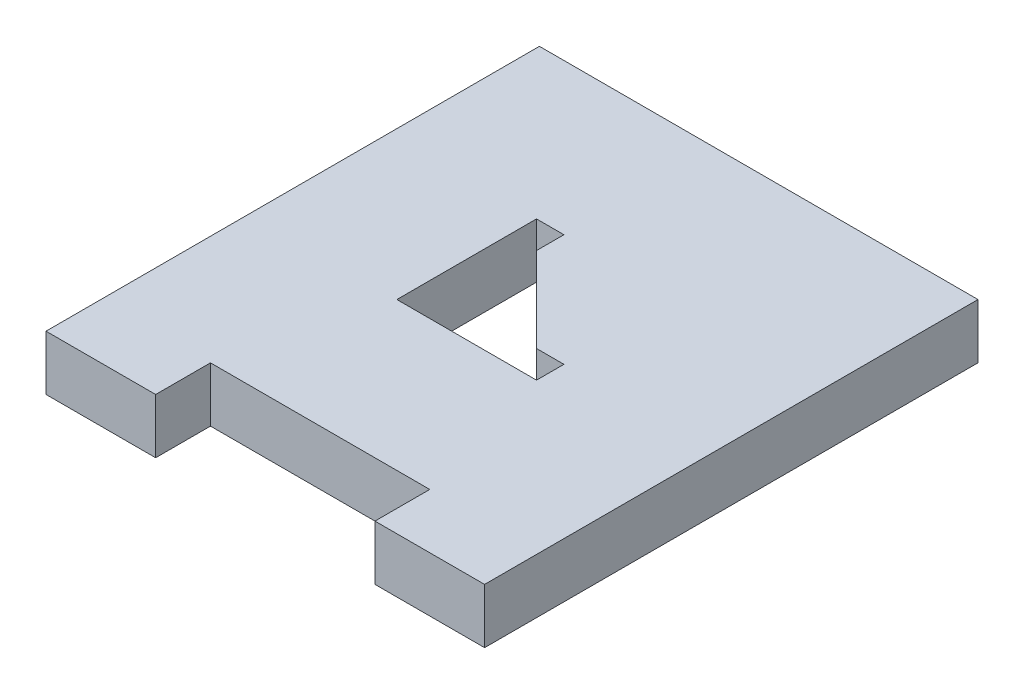
ISO-10303-21;
HEADER;
FILE_DESCRIPTION(('STEP AP214'),'2;1');
FILE_NAME('part.step','',(''),(''),'','','');
FILE_SCHEMA(('AUTOMOTIVE_DESIGN { 1 0 10303 214 1 1 1 1 }'));
ENDSEC;
DATA;
#1=APPLICATION_CONTEXT('core data for automotive mechanical design processes');
#2=APPLICATION_PROTOCOL_DEFINITION('international standard','automotive_design',2000,#1);
#3=PRODUCT_CONTEXT('',#1,'mechanical');
#4=PRODUCT('Part','Part','',(#3));
#5=PRODUCT_RELATED_PRODUCT_CATEGORY('part','',(#4));
#6=PRODUCT_DEFINITION_FORMATION('','',#4);
#7=PRODUCT_DEFINITION_CONTEXT('part definition',#1,'design');
#8=PRODUCT_DEFINITION('design','',#6,#7);
#9=PRODUCT_DEFINITION_SHAPE('','',#8);
#10=(LENGTH_UNIT() NAMED_UNIT(*) SI_UNIT(.MILLI.,.METRE.));
#11=(NAMED_UNIT(*) PLANE_ANGLE_UNIT() SI_UNIT($,.RADIAN.));
#12=(NAMED_UNIT(*) SI_UNIT($,.STERADIAN.) SOLID_ANGLE_UNIT());
#13=UNCERTAINTY_MEASURE_WITH_UNIT(LENGTH_MEASURE(1.E-05),#10,'distance_accuracy_value','');
#14=(GEOMETRIC_REPRESENTATION_CONTEXT(3) GLOBAL_UNCERTAINTY_ASSIGNED_CONTEXT((#13)) GLOBAL_UNIT_ASSIGNED_CONTEXT((#10,
#11,#12)) REPRESENTATION_CONTEXT('',''));
#15=CARTESIAN_POINT('',(0.,0.,0.));
#16=DIRECTION('',(0.,0.,1.));
#17=DIRECTION('',(1.,0.,0.));
#18=AXIS2_PLACEMENT_3D('',#15,#16,#17);
#19=CARTESIAN_POINT('',(-12.7,3.175,12.7));
#20=DIRECTION('',(0.,0.,-1.));
#21=DIRECTION('',(-1.,0.,0.));
#22=AXIS2_PLACEMENT_3D('',#19,#20,#21);
#23=PLANE('',#22);
#24=DIRECTION('',(0.,-1.,0.));
#25=VECTOR('',#24,1.);
#26=CARTESIAN_POINT('',(6.35,3.175,12.7));
#27=LINE('',#26,#25);
#28=CARTESIAN_POINT('',(6.35,3.175,12.7));
#29=VERTEX_POINT('',#28);
#30=CARTESIAN_POINT('',(6.35,0.,12.7));
#31=VERTEX_POINT('',#30);
#32=EDGE_CURVE('E251',#29,#31,#27,.T.);
#33=ORIENTED_EDGE('',*,*,#32,.F.);
#34=DIRECTION('',(1.,0.,0.));
#35=VECTOR('',#34,1.);
#36=CARTESIAN_POINT('',(-12.7,3.175,12.7));
#37=LINE('',#36,#35);
#38=CARTESIAN_POINT('',(-6.35,3.175,12.7));
#39=VERTEX_POINT('',#38);
#40=EDGE_CURVE('E209',#39,#29,#37,.T.);
#41=ORIENTED_EDGE('',*,*,#40,.F.);
#42=DIRECTION('',(0.,1.,0.));
#43=VECTOR('',#42,1.);
#44=CARTESIAN_POINT('',(-6.35,3.175,12.7));
#45=LINE('',#44,#43);
#46=CARTESIAN_POINT('',(-6.35,0.,12.7));
#47=VERTEX_POINT('',#46);
#48=EDGE_CURVE('E55',#47,#39,#45,.T.);
#49=ORIENTED_EDGE('',*,*,#48,.F.);
#50=DIRECTION('',(1.,0.,0.));
#51=VECTOR('',#50,1.);
#52=CARTESIAN_POINT('',(-12.7,0.,12.7));
#53=LINE('',#52,#51);
#54=EDGE_CURVE('E205',#47,#31,#53,.T.);
#55=ORIENTED_EDGE('',*,*,#54,.T.);
#56=EDGE_LOOP('',(#33,#41,#49,#55));
#57=FACE_BOUND('',#56,.T.);
#58=ADVANCED_FACE('F33',(#57),#23,.F.);
#59=CARTESIAN_POINT('',(0.,3.175,0.));
#60=DIRECTION('',(0.,-1.,0.));
#61=DIRECTION('',(0.,0.,-1.));
#62=AXIS2_PLACEMENT_3D('',#59,#60,#61);
#63=PLANE('',#62);
#64=DIRECTION('',(0.,0.,-1.));
#65=VECTOR('',#64,1.);
#66=CARTESIAN_POINT('',(12.7,3.175,12.7));
#67=LINE('',#66,#65);
#68=CARTESIAN_POINT('',(12.7,3.175,15.875));
#69=VERTEX_POINT('',#68);
#70=CARTESIAN_POINT('',(12.7,3.175,-12.7));
#71=VERTEX_POINT('',#70);
#72=EDGE_CURVE('E201',#69,#71,#67,.T.);
#73=ORIENTED_EDGE('',*,*,#72,.T.);
#74=DIRECTION('',(-1.,0.,0.));
#75=VECTOR('',#74,1.);
#76=CARTESIAN_POINT('',(-12.7,3.175,-12.7));
#77=LINE('',#76,#75);
#78=CARTESIAN_POINT('',(-12.7,3.175,-12.7));
#79=VERTEX_POINT('',#78);
#80=EDGE_CURVE('E204',#71,#79,#77,.T.);
#81=ORIENTED_EDGE('',*,*,#80,.T.);
#82=DIRECTION('',(0.,0.,1.));
#83=VECTOR('',#82,1.);
#84=CARTESIAN_POINT('',(-12.7,3.175,12.7));
#85=LINE('',#84,#83);
#86=CARTESIAN_POINT('',(-12.7,3.175,15.875));
#87=VERTEX_POINT('',#86);
#88=EDGE_CURVE('E207',#79,#87,#85,.T.);
#89=ORIENTED_EDGE('',*,*,#88,.T.);
#90=DIRECTION('',(-1.,0.,0.));
#91=VECTOR('',#90,1.);
#92=CARTESIAN_POINT('',(-12.7,3.175,15.875));
#93=LINE('',#92,#91);
#94=CARTESIAN_POINT('',(-6.35,3.175,15.875));
#95=VERTEX_POINT('',#94);
#96=EDGE_CURVE('E228',#95,#87,#93,.T.);
#97=ORIENTED_EDGE('',*,*,#96,.F.);
#98=DIRECTION('',(0.,0.,-1.));
#99=VECTOR('',#98,1.);
#100=CARTESIAN_POINT('',(-6.35,3.175,15.875));
#101=LINE('',#100,#99);
#102=EDGE_CURVE('E224',#95,#39,#101,.T.);
#103=ORIENTED_EDGE('',*,*,#102,.T.);
#104=ORIENTED_EDGE('',*,*,#40,.T.);
#105=DIRECTION('',(0.,0.,-1.));
#106=VECTOR('',#105,1.);
#107=CARTESIAN_POINT('',(6.35,3.175,15.875));
#108=LINE('',#107,#106);
#109=CARTESIAN_POINT('',(6.35,3.175,15.875));
#110=VERTEX_POINT('',#109);
#111=EDGE_CURVE('E223',#110,#29,#108,.T.);
#112=ORIENTED_EDGE('',*,*,#111,.F.);
#113=DIRECTION('',(-1.,0.,0.));
#114=VECTOR('',#113,1.);
#115=CARTESIAN_POINT('',(12.7,3.175,15.875));
#116=LINE('',#115,#114);
#117=EDGE_CURVE('E258',#69,#110,#116,.T.);
#118=ORIENTED_EDGE('',*,*,#117,.F.);
#119=EDGE_LOOP('',(#73,#81,#89,#97,#103,#104,#112,#118));
#120=FACE_BOUND('',#119,.T.);
#121=DIRECTION('',(0.,0.,-1.));
#122=VECTOR('',#121,1.);
#123=CARTESIAN_POINT('',(-2.54,3.175,-3.95986));
#124=LINE('',#123,#122);
#125=CARTESIAN_POINT('',(-2.54,3.175,-2.37236));
#126=VERTEX_POINT('',#125);
#127=CARTESIAN_POINT('',(-2.54,3.175,-3.95986));
#128=VERTEX_POINT('',#127);
#129=EDGE_CURVE('E154',#126,#128,#124,.T.);
#130=ORIENTED_EDGE('',*,*,#129,.F.);
#131=DIRECTION('',(-0.707106781186547,0.,-0.707106781186548));
#132=VECTOR('',#131,1.);
#133=CARTESIAN_POINT('',(2.37235999999999,3.175,2.54));
#134=LINE('',#133,#132);
#135=CARTESIAN_POINT('',(2.37235999999999,3.175,2.54));
#136=VERTEX_POINT('',#135);
#137=EDGE_CURVE('E47',#136,#126,#134,.T.);
#138=ORIENTED_EDGE('',*,*,#137,.F.);
#139=DIRECTION('',(-1.,0.,0.));
#140=VECTOR('',#139,1.);
#141=CARTESIAN_POINT('',(3.95986,3.175,2.54));
#142=LINE('',#141,#140);
#143=CARTESIAN_POINT('',(3.95986,3.175,2.54));
#144=VERTEX_POINT('',#143);
#145=EDGE_CURVE('E152',#144,#136,#142,.T.);
#146=ORIENTED_EDGE('',*,*,#145,.F.);
#147=DIRECTION('',(0.,0.,-1.));
#148=VECTOR('',#147,1.);
#149=CARTESIAN_POINT('',(3.95985999999999,3.175,4.12750000000001));
#150=LINE('',#149,#148);
#151=CARTESIAN_POINT('',(3.95985999999999,3.175,4.12750000000001));
#152=VERTEX_POINT('',#151);
#153=EDGE_CURVE('E159',#152,#144,#150,.T.);
#154=ORIENTED_EDGE('',*,*,#153,.F.);
#155=DIRECTION('',(1.,0.,0.));
#156=VECTOR('',#155,1.);
#157=CARTESIAN_POINT('',(-4.1275,3.175,4.1275));
#158=LINE('',#157,#156);
#159=CARTESIAN_POINT('',(-4.1275,3.175,4.1275));
#160=VERTEX_POINT('',#159);
#161=EDGE_CURVE('E163',#160,#152,#158,.T.);
#162=ORIENTED_EDGE('',*,*,#161,.F.);
#163=DIRECTION('',(0.,0.,1.));
#164=VECTOR('',#163,1.);
#165=CARTESIAN_POINT('',(-4.1275,3.175,4.1275));
#166=LINE('',#165,#164);
#167=CARTESIAN_POINT('',(-4.1275,3.175,-3.95986));
#168=VERTEX_POINT('',#167);
#169=EDGE_CURVE('E169',#168,#160,#166,.T.);
#170=ORIENTED_EDGE('',*,*,#169,.F.);
#171=DIRECTION('',(-1.,0.,0.));
#172=VECTOR('',#171,1.);
#173=CARTESIAN_POINT('',(-4.1275,3.175,-3.95986));
#174=LINE('',#173,#172);
#175=EDGE_CURVE('E161',#128,#168,#174,.T.);
#176=ORIENTED_EDGE('',*,*,#175,.F.);
#177=EDGE_LOOP('',(#130,#138,#146,#154,#162,#170,#176));
#178=FACE_BOUND('',#177,.T.);
#179=ADVANCED_FACE('F150',(#120,#178),#63,.F.);
#180=CARTESIAN_POINT('',(0.,0.,0.));
#181=DIRECTION('',(0.,-1.,0.));
#182=DIRECTION('',(0.,0.,-1.));
#183=AXIS2_PLACEMENT_3D('',#180,#181,#182);
#184=PLANE('',#183);
#185=DIRECTION('',(0.707106781186547,0.,0.707106781186548));
#186=VECTOR('',#185,1.);
#187=CARTESIAN_POINT('',(-0.0838200000000044,0.,0.0838200000000042));
#188=LINE('',#187,#186);
#189=CARTESIAN_POINT('',(-2.54,0.,-2.37236));
#190=VERTEX_POINT('',#189);
#191=CARTESIAN_POINT('',(2.37235999999999,0.,2.54));
#192=VERTEX_POINT('',#191);
#193=EDGE_CURVE('E141',#190,#192,#188,.T.);
#194=ORIENTED_EDGE('',*,*,#193,.F.);
#195=DIRECTION('',(0.,0.,-1.));
#196=VECTOR('',#195,1.);
#197=CARTESIAN_POINT('',(-2.54,0.,-3.95986));
#198=LINE('',#197,#196);
#199=CARTESIAN_POINT('',(-2.54,0.,-3.95986));
#200=VERTEX_POINT('',#199);
#201=EDGE_CURVE('E181',#190,#200,#198,.T.);
#202=ORIENTED_EDGE('',*,*,#201,.T.);
#203=DIRECTION('',(-1.,0.,0.));
#204=VECTOR('',#203,1.);
#205=CARTESIAN_POINT('',(-4.1275,0.,-3.95986));
#206=LINE('',#205,#204);
#207=CARTESIAN_POINT('',(-4.1275,0.,-3.95986));
#208=VERTEX_POINT('',#207);
#209=EDGE_CURVE('E183',#200,#208,#206,.T.);
#210=ORIENTED_EDGE('',*,*,#209,.T.);
#211=DIRECTION('',(0.,0.,1.));
#212=VECTOR('',#211,1.);
#213=CARTESIAN_POINT('',(-4.1275,0.,4.1275));
#214=LINE('',#213,#212);
#215=CARTESIAN_POINT('',(-4.1275,0.,4.1275));
#216=VERTEX_POINT('',#215);
#217=EDGE_CURVE('E186',#208,#216,#214,.T.);
#218=ORIENTED_EDGE('',*,*,#217,.T.);
#219=DIRECTION('',(1.,0.,0.));
#220=VECTOR('',#219,1.);
#221=CARTESIAN_POINT('',(-4.1275,0.,4.1275));
#222=LINE('',#221,#220);
#223=CARTESIAN_POINT('',(3.95985999999999,0.,4.12750000000001));
#224=VERTEX_POINT('',#223);
#225=EDGE_CURVE('E172',#216,#224,#222,.T.);
#226=ORIENTED_EDGE('',*,*,#225,.T.);
#227=DIRECTION('',(0.,0.,-1.));
#228=VECTOR('',#227,1.);
#229=CARTESIAN_POINT('',(3.95985999999999,0.,4.12750000000001));
#230=LINE('',#229,#228);
#231=CARTESIAN_POINT('',(3.95986,0.,2.54));
#232=VERTEX_POINT('',#231);
#233=EDGE_CURVE('E175',#224,#232,#230,.T.);
#234=ORIENTED_EDGE('',*,*,#233,.T.);
#235=DIRECTION('',(-1.,0.,0.));
#236=VECTOR('',#235,1.);
#237=CARTESIAN_POINT('',(3.95986,0.,2.54));
#238=LINE('',#237,#236);
#239=EDGE_CURVE('E179',#232,#192,#238,.T.);
#240=ORIENTED_EDGE('',*,*,#239,.T.);
#241=EDGE_LOOP('',(#194,#202,#210,#218,#226,#234,#240));
#242=FACE_BOUND('',#241,.T.);
#243=DIRECTION('',(0.,0.,-1.));
#244=VECTOR('',#243,1.);
#245=CARTESIAN_POINT('',(12.7,0.,12.7));
#246=LINE('',#245,#244);
#247=CARTESIAN_POINT('',(12.7,0.,15.875));
#248=VERTEX_POINT('',#247);
#249=CARTESIAN_POINT('',(12.7,0.,-12.7));
#250=VERTEX_POINT('',#249);
#251=EDGE_CURVE('E200',#248,#250,#246,.T.);
#252=ORIENTED_EDGE('',*,*,#251,.F.);
#253=DIRECTION('',(1.,0.,0.));
#254=VECTOR('',#253,1.);
#255=CARTESIAN_POINT('',(12.7,0.,15.875));
#256=LINE('',#255,#254);
#257=CARTESIAN_POINT('',(6.35,0.,15.875));
#258=VERTEX_POINT('',#257);
#259=EDGE_CURVE('E262',#258,#248,#256,.T.);
#260=ORIENTED_EDGE('',*,*,#259,.F.);
#261=DIRECTION('',(0.,0.,-1.));
#262=VECTOR('',#261,1.);
#263=CARTESIAN_POINT('',(6.35,0.,15.875));
#264=LINE('',#263,#262);
#265=EDGE_CURVE('E264',#258,#31,#264,.T.);
#266=ORIENTED_EDGE('',*,*,#265,.T.);
#267=ORIENTED_EDGE('',*,*,#54,.F.);
#268=DIRECTION('',(0.,0.,-1.));
#269=VECTOR('',#268,1.);
#270=CARTESIAN_POINT('',(-6.35,0.,15.875));
#271=LINE('',#270,#269);
#272=CARTESIAN_POINT('',(-6.35,0.,15.875));
#273=VERTEX_POINT('',#272);
#274=EDGE_CURVE('E176',#273,#47,#271,.T.);
#275=ORIENTED_EDGE('',*,*,#274,.F.);
#276=DIRECTION('',(1.,0.,0.));
#277=VECTOR('',#276,1.);
#278=CARTESIAN_POINT('',(-12.7,0.,15.875));
#279=LINE('',#278,#277);
#280=CARTESIAN_POINT('',(-12.7,0.,15.875));
#281=VERTEX_POINT('',#280);
#282=EDGE_CURVE('E271',#281,#273,#279,.T.);
#283=ORIENTED_EDGE('',*,*,#282,.F.);
#284=DIRECTION('',(0.,0.,1.));
#285=VECTOR('',#284,1.);
#286=CARTESIAN_POINT('',(-12.7,0.,12.7));
#287=LINE('',#286,#285);
#288=CARTESIAN_POINT('',(-12.7,0.,-12.7));
#289=VERTEX_POINT('',#288);
#290=EDGE_CURVE('E293',#289,#281,#287,.T.);
#291=ORIENTED_EDGE('',*,*,#290,.F.);
#292=DIRECTION('',(-1.,0.,0.));
#293=VECTOR('',#292,1.);
#294=CARTESIAN_POINT('',(-12.7,0.,-12.7));
#295=LINE('',#294,#293);
#296=EDGE_CURVE('E294',#250,#289,#295,.T.);
#297=ORIENTED_EDGE('',*,*,#296,.F.);
#298=EDGE_LOOP('',(#252,#260,#266,#267,#275,#283,#291,#297));
#299=FACE_BOUND('',#298,.T.);
#300=ADVANCED_FACE('F239',(#242,#299),#184,.T.);
#301=CARTESIAN_POINT('',(12.7,3.175,12.7));
#302=DIRECTION('',(-1.,0.,0.));
#303=DIRECTION('',(0.,0.,1.));
#304=AXIS2_PLACEMENT_3D('',#301,#302,#303);
#305=PLANE('',#304);
#306=ORIENTED_EDGE('',*,*,#251,.T.);
#307=DIRECTION('',(0.,-1.,0.));
#308=VECTOR('',#307,1.);
#309=CARTESIAN_POINT('',(12.7,3.175,-12.7));
#310=LINE('',#309,#308);
#311=EDGE_CURVE('E41',#71,#250,#310,.T.);
#312=ORIENTED_EDGE('',*,*,#311,.F.);
#313=ORIENTED_EDGE('',*,*,#72,.F.);
#314=DIRECTION('',(0.,1.,0.));
#315=VECTOR('',#314,1.);
#316=CARTESIAN_POINT('',(12.7,3.175,15.875));
#317=LINE('',#316,#315);
#318=EDGE_CURVE('E253',#248,#69,#317,.T.);
#319=ORIENTED_EDGE('',*,*,#318,.F.);
#320=EDGE_LOOP('',(#306,#312,#313,#319));
#321=FACE_BOUND('',#320,.T.);
#322=ADVANCED_FACE('F35',(#321),#305,.F.);
#323=CARTESIAN_POINT('',(-12.7,3.175,-12.7));
#324=DIRECTION('',(0.,0.,1.));
#325=DIRECTION('',(1.,0.,0.));
#326=AXIS2_PLACEMENT_3D('',#323,#324,#325);
#327=PLANE('',#326);
#328=ORIENTED_EDGE('',*,*,#296,.T.);
#329=DIRECTION('',(0.,-1.,0.));
#330=VECTOR('',#329,1.);
#331=CARTESIAN_POINT('',(-12.7,3.175,-12.7));
#332=LINE('',#331,#330);
#333=EDGE_CURVE('E217',#79,#289,#332,.T.);
#334=ORIENTED_EDGE('',*,*,#333,.F.);
#335=ORIENTED_EDGE('',*,*,#80,.F.);
#336=ORIENTED_EDGE('',*,*,#311,.T.);
#337=EDGE_LOOP('',(#328,#334,#335,#336));
#338=FACE_BOUND('',#337,.T.);
#339=ADVANCED_FACE('F304',(#338),#327,.F.);
#340=CARTESIAN_POINT('',(-12.7,3.175,12.7));
#341=DIRECTION('',(1.,0.,0.));
#342=DIRECTION('',(0.,0.,-1.));
#343=AXIS2_PLACEMENT_3D('',#340,#341,#342);
#344=PLANE('',#343);
#345=ORIENTED_EDGE('',*,*,#290,.T.);
#346=DIRECTION('',(0.,-1.,0.));
#347=VECTOR('',#346,1.);
#348=CARTESIAN_POINT('',(-12.7,3.175,15.875));
#349=LINE('',#348,#347);
#350=EDGE_CURVE('E222',#87,#281,#349,.T.);
#351=ORIENTED_EDGE('',*,*,#350,.F.);
#352=ORIENTED_EDGE('',*,*,#88,.F.);
#353=ORIENTED_EDGE('',*,*,#333,.T.);
#354=EDGE_LOOP('',(#345,#351,#352,#353));
#355=FACE_BOUND('',#354,.T.);
#356=ADVANCED_FACE('F316',(#355),#344,.F.);
#357=CARTESIAN_POINT('',(-4.1275,3.175,4.1275));
#358=DIRECTION('',(0.,0.,-1.));
#359=DIRECTION('',(-1.,0.,0.));
#360=AXIS2_PLACEMENT_3D('',#357,#358,#359);
#361=PLANE('',#360);
#362=ORIENTED_EDGE('',*,*,#225,.F.);
#363=DIRECTION('',(0.,-1.,0.));
#364=VECTOR('',#363,1.);
#365=CARTESIAN_POINT('',(-4.1275,3.175,4.1275));
#366=LINE('',#365,#364);
#367=EDGE_CURVE('E171',#160,#216,#366,.T.);
#368=ORIENTED_EDGE('',*,*,#367,.F.);
#369=ORIENTED_EDGE('',*,*,#161,.T.);
#370=DIRECTION('',(0.,-1.,0.));
#371=VECTOR('',#370,1.);
#372=CARTESIAN_POINT('',(3.95985999999999,3.175,4.12750000000001));
#373=LINE('',#372,#371);
#374=EDGE_CURVE('E197',#152,#224,#373,.T.);
#375=ORIENTED_EDGE('',*,*,#374,.T.);
#376=EDGE_LOOP('',(#362,#368,#369,#375));
#377=FACE_BOUND('',#376,.T.);
#378=ADVANCED_FACE('F234',(#377),#361,.T.);
#379=CARTESIAN_POINT('',(3.95985999999999,3.175,4.12750000000001));
#380=DIRECTION('',(-1.,0.,0.));
#381=DIRECTION('',(0.,0.,1.));
#382=AXIS2_PLACEMENT_3D('',#379,#380,#381);
#383=PLANE('',#382);
#384=ORIENTED_EDGE('',*,*,#233,.F.);
#385=ORIENTED_EDGE('',*,*,#374,.F.);
#386=ORIENTED_EDGE('',*,*,#153,.T.);
#387=DIRECTION('',(0.,-1.,0.));
#388=VECTOR('',#387,1.);
#389=CARTESIAN_POINT('',(3.95986,3.175,2.54));
#390=LINE('',#389,#388);
#391=EDGE_CURVE('E158',#144,#232,#390,.T.);
#392=ORIENTED_EDGE('',*,*,#391,.T.);
#393=EDGE_LOOP('',(#384,#385,#386,#392));
#394=FACE_BOUND('',#393,.T.);
#395=ADVANCED_FACE('F237',(#394),#383,.T.);
#396=CARTESIAN_POINT('',(3.95986,3.175,2.54));
#397=DIRECTION('',(0.,0.,1.));
#398=DIRECTION('',(1.,0.,0.));
#399=AXIS2_PLACEMENT_3D('',#396,#397,#398);
#400=PLANE('',#399);
#401=DIRECTION('',(0.,1.,0.));
#402=VECTOR('',#401,1.);
#403=CARTESIAN_POINT('',(2.37235999999999,-3.175,2.54));
#404=LINE('',#403,#402);
#405=EDGE_CURVE('E138',#192,#136,#404,.T.);
#406=ORIENTED_EDGE('',*,*,#405,.F.);
#407=ORIENTED_EDGE('',*,*,#239,.F.);
#408=ORIENTED_EDGE('',*,*,#391,.F.);
#409=ORIENTED_EDGE('',*,*,#145,.T.);
#410=EDGE_LOOP('',(#406,#407,#408,#409));
#411=FACE_BOUND('',#410,.T.);
#412=ADVANCED_FACE('F157',(#411),#400,.T.);
#413=CARTESIAN_POINT('',(-2.54,3.175,-3.95986));
#414=DIRECTION('',(-1.,0.,0.));
#415=DIRECTION('',(0.,0.,1.));
#416=AXIS2_PLACEMENT_3D('',#413,#414,#415);
#417=PLANE('',#416);
#418=DIRECTION('',(0.,-1.,0.));
#419=VECTOR('',#418,1.);
#420=CARTESIAN_POINT('',(-2.54,3.175,-2.37236));
#421=LINE('',#420,#419);
#422=EDGE_CURVE('E11',#126,#190,#421,.T.);
#423=ORIENTED_EDGE('',*,*,#422,.F.);
#424=ORIENTED_EDGE('',*,*,#129,.T.);
#425=DIRECTION('',(0.,-1.,0.));
#426=VECTOR('',#425,1.);
#427=CARTESIAN_POINT('',(-2.54,3.175,-3.95986));
#428=LINE('',#427,#426);
#429=EDGE_CURVE('E193',#128,#200,#428,.T.);
#430=ORIENTED_EDGE('',*,*,#429,.T.);
#431=ORIENTED_EDGE('',*,*,#201,.F.);
#432=EDGE_LOOP('',(#423,#424,#430,#431));
#433=FACE_BOUND('',#432,.T.);
#434=ADVANCED_FACE('F250',(#433),#417,.T.);
#435=CARTESIAN_POINT('',(-4.1275,3.175,-3.95986));
#436=DIRECTION('',(0.,0.,1.));
#437=DIRECTION('',(1.,0.,0.));
#438=AXIS2_PLACEMENT_3D('',#435,#436,#437);
#439=PLANE('',#438);
#440=ORIENTED_EDGE('',*,*,#209,.F.);
#441=ORIENTED_EDGE('',*,*,#429,.F.);
#442=ORIENTED_EDGE('',*,*,#175,.T.);
#443=DIRECTION('',(0.,-1.,0.));
#444=VECTOR('',#443,1.);
#445=CARTESIAN_POINT('',(-4.1275,3.175,-3.95986));
#446=LINE('',#445,#444);
#447=EDGE_CURVE('E191',#168,#208,#446,.T.);
#448=ORIENTED_EDGE('',*,*,#447,.T.);
#449=EDGE_LOOP('',(#440,#441,#442,#448));
#450=FACE_BOUND('',#449,.T.);
#451=ADVANCED_FACE('F247',(#450),#439,.T.);
#452=CARTESIAN_POINT('',(-4.1275,3.175,4.1275));
#453=DIRECTION('',(1.,0.,0.));
#454=DIRECTION('',(0.,0.,-1.));
#455=AXIS2_PLACEMENT_3D('',#452,#453,#454);
#456=PLANE('',#455);
#457=ORIENTED_EDGE('',*,*,#217,.F.);
#458=ORIENTED_EDGE('',*,*,#447,.F.);
#459=ORIENTED_EDGE('',*,*,#169,.T.);
#460=ORIENTED_EDGE('',*,*,#367,.T.);
#461=EDGE_LOOP('',(#457,#458,#459,#460));
#462=FACE_BOUND('',#461,.T.);
#463=ADVANCED_FACE('F243',(#462),#456,.T.);
#464=CARTESIAN_POINT('',(-6.35,3.175,15.875));
#465=DIRECTION('',(-1.,0.,0.));
#466=DIRECTION('',(0.,0.,1.));
#467=AXIS2_PLACEMENT_3D('',#464,#465,#466);
#468=PLANE('',#467);
#469=ORIENTED_EDGE('',*,*,#48,.T.);
#470=ORIENTED_EDGE('',*,*,#102,.F.);
#471=DIRECTION('',(0.,1.,0.));
#472=VECTOR('',#471,1.);
#473=CARTESIAN_POINT('',(-6.35,3.175,15.875));
#474=LINE('',#473,#472);
#475=EDGE_CURVE('E272',#273,#95,#474,.T.);
#476=ORIENTED_EDGE('',*,*,#475,.F.);
#477=ORIENTED_EDGE('',*,*,#274,.T.);
#478=EDGE_LOOP('',(#469,#470,#476,#477));
#479=FACE_BOUND('',#478,.T.);
#480=ADVANCED_FACE('F287',(#479),#468,.F.);
#481=CARTESIAN_POINT('',(0.,0.,15.875));
#482=DIRECTION('',(0.,0.,1.));
#483=DIRECTION('',(1.,0.,0.));
#484=AXIS2_PLACEMENT_3D('',#481,#482,#483);
#485=PLANE('',#484);
#486=ORIENTED_EDGE('',*,*,#350,.T.);
#487=ORIENTED_EDGE('',*,*,#282,.T.);
#488=ORIENTED_EDGE('',*,*,#475,.T.);
#489=ORIENTED_EDGE('',*,*,#96,.T.);
#490=EDGE_LOOP('',(#486,#487,#488,#489));
#491=FACE_BOUND('',#490,.T.);
#492=ADVANCED_FACE('F317',(#491),#485,.T.);
#493=CARTESIAN_POINT('',(6.35,3.175,15.875));
#494=DIRECTION('',(1.,0.,0.));
#495=DIRECTION('',(0.,1.,0.));
#496=AXIS2_PLACEMENT_3D('',#493,#494,#495);
#497=PLANE('',#496);
#498=ORIENTED_EDGE('',*,*,#32,.T.);
#499=ORIENTED_EDGE('',*,*,#265,.F.);
#500=DIRECTION('',(0.,-1.,0.));
#501=VECTOR('',#500,1.);
#502=CARTESIAN_POINT('',(6.35,3.175,15.875));
#503=LINE('',#502,#501);
#504=EDGE_CURVE('E260',#110,#258,#503,.T.);
#505=ORIENTED_EDGE('',*,*,#504,.F.);
#506=ORIENTED_EDGE('',*,*,#111,.T.);
#507=EDGE_LOOP('',(#498,#499,#505,#506));
#508=FACE_BOUND('',#507,.T.);
#509=ADVANCED_FACE('F314',(#508),#497,.F.);
#510=CARTESIAN_POINT('',(0.,0.,15.875));
#511=DIRECTION('',(0.,0.,-1.));
#512=DIRECTION('',(-1.,0.,0.));
#513=AXIS2_PLACEMENT_3D('',#510,#511,#512);
#514=PLANE('',#513);
#515=ORIENTED_EDGE('',*,*,#318,.T.);
#516=ORIENTED_EDGE('',*,*,#117,.T.);
#517=ORIENTED_EDGE('',*,*,#504,.T.);
#518=ORIENTED_EDGE('',*,*,#259,.T.);
#519=EDGE_LOOP('',(#515,#516,#517,#518));
#520=FACE_BOUND('',#519,.T.);
#521=ADVANCED_FACE('F309',(#520),#514,.F.);
#522=CARTESIAN_POINT('',(2.37235999999999,-3.175,2.54));
#523=DIRECTION('',(0.707106781186548,0.,-0.707106781186547));
#524=DIRECTION('',(-0.707106781186547,0.,-0.707106781186548));
#525=AXIS2_PLACEMENT_3D('',#522,#523,#524);
#526=PLANE('',#525);
#527=ORIENTED_EDGE('',*,*,#193,.T.);
#528=ORIENTED_EDGE('',*,*,#405,.T.);
#529=ORIENTED_EDGE('',*,*,#137,.T.);
#530=ORIENTED_EDGE('',*,*,#422,.T.);
#531=EDGE_LOOP('',(#527,#528,#529,#530));
#532=FACE_BOUND('',#531,.T.);
#533=ADVANCED_FACE('F139',(#532),#526,.F.);
#534=CLOSED_SHELL('',(#58,#179,#300,#322,#339,#356,#378,#395,#412,#434,#451,#463,#480,#492,#509,
#521,#533));
#535=MANIFOLD_SOLID_BREP('B2',#534);
#536=ADVANCED_BREP_SHAPE_REPRESENTATION('',(#18,#535),#14);
#537=SHAPE_DEFINITION_REPRESENTATION(#9,#536);
ENDSEC;
END-ISO-10303-21;
